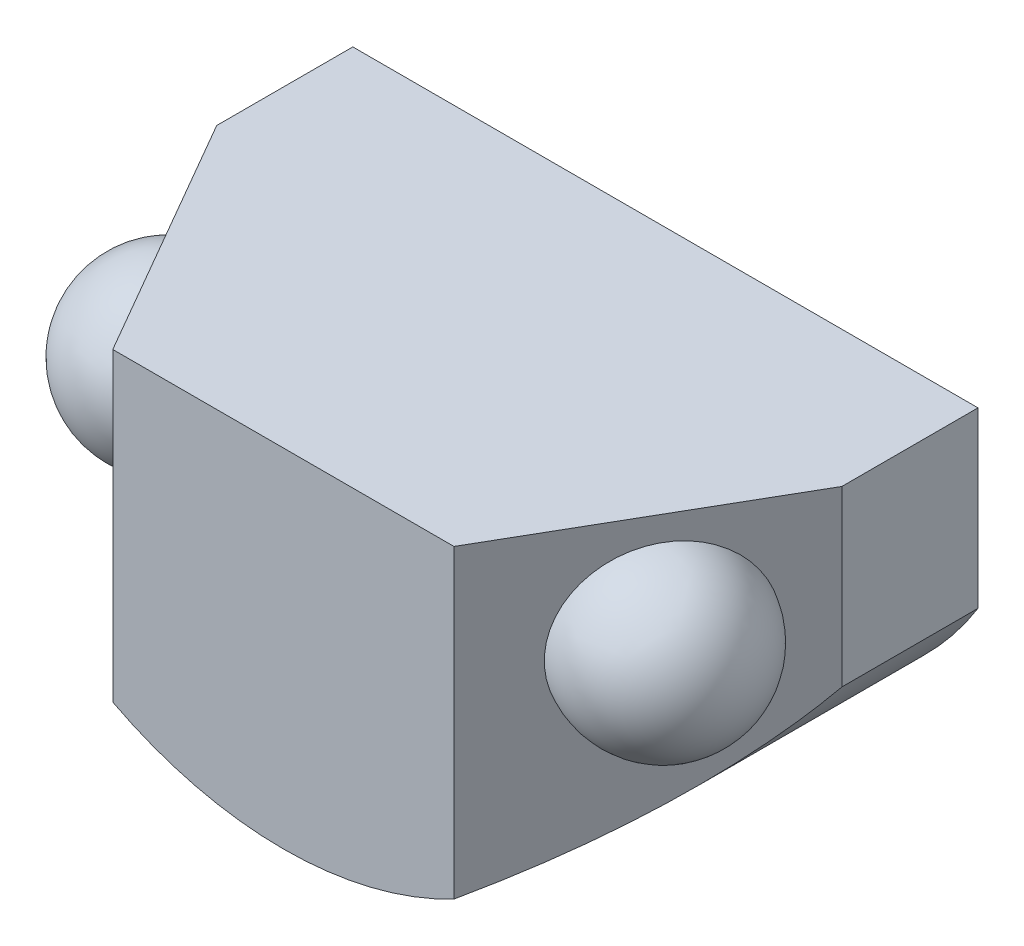
ISO-10303-21;
HEADER;
FILE_DESCRIPTION(('STEP AP214'),'2;1');
FILE_NAME('part.step','',(''),(''),'','','');
FILE_SCHEMA(('AUTOMOTIVE_DESIGN { 1 0 10303 214 1 1 1 1 }'));
ENDSEC;
DATA;
#1=APPLICATION_CONTEXT('core data for automotive mechanical design processes');
#2=APPLICATION_PROTOCOL_DEFINITION('international standard','automotive_design',2000,#1);
#3=PRODUCT_CONTEXT('',#1,'mechanical');
#4=PRODUCT('Part','Part','',(#3));
#5=PRODUCT_RELATED_PRODUCT_CATEGORY('part','',(#4));
#6=PRODUCT_DEFINITION_FORMATION('','',#4);
#7=PRODUCT_DEFINITION_CONTEXT('part definition',#1,'design');
#8=PRODUCT_DEFINITION('design','',#6,#7);
#9=PRODUCT_DEFINITION_SHAPE('','',#8);
#10=(LENGTH_UNIT() NAMED_UNIT(*) SI_UNIT(.MILLI.,.METRE.));
#11=(NAMED_UNIT(*) PLANE_ANGLE_UNIT() SI_UNIT($,.RADIAN.));
#12=(NAMED_UNIT(*) SI_UNIT($,.STERADIAN.) SOLID_ANGLE_UNIT());
#13=UNCERTAINTY_MEASURE_WITH_UNIT(LENGTH_MEASURE(1.E-05),#10,'distance_accuracy_value','');
#14=(GEOMETRIC_REPRESENTATION_CONTEXT(3) GLOBAL_UNCERTAINTY_ASSIGNED_CONTEXT((#13)) GLOBAL_UNIT_ASSIGNED_CONTEXT((#10,
#11,#12)) REPRESENTATION_CONTEXT('',''));
#15=CARTESIAN_POINT('',(0.,0.,0.));
#16=DIRECTION('',(0.,0.,1.));
#17=DIRECTION('',(1.,0.,0.));
#18=AXIS2_PLACEMENT_3D('',#15,#16,#17);
#19=CARTESIAN_POINT('',(90.,50.,55.));
#20=DIRECTION('',(-1.,0.,0.));
#21=DIRECTION('',(0.,0.,1.));
#22=AXIS2_PLACEMENT_3D('',#19,#20,#21);
#23=PLANE('',#22);
#24=DIRECTION('',(0.,1.,0.));
#25=VECTOR('',#24,1.);
#26=CARTESIAN_POINT('',(90.,-50.,-15.808309090852));
#27=LINE('',#26,#25);
#28=CARTESIAN_POINT('',(90.,0.,-15.808309090852));
#29=VERTEX_POINT('',#28);
#30=CARTESIAN_POINT('',(90.,50.,-15.808309090852));
#31=VERTEX_POINT('',#30);
#32=EDGE_CURVE('E86',#29,#31,#27,.T.);
#33=ORIENTED_EDGE('',*,*,#32,.F.);
#34=DIRECTION('',(0.,0.,-1.));
#35=VECTOR('',#34,1.);
#36=CARTESIAN_POINT('',(90.,0.,55.));
#37=LINE('',#36,#35);
#38=CARTESIAN_POINT('',(90.,0.,-55.));
#39=VERTEX_POINT('',#38);
#40=EDGE_CURVE('E113',#29,#39,#37,.T.);
#41=ORIENTED_EDGE('',*,*,#40,.T.);
#42=DIRECTION('',(0.,-1.,0.));
#43=VECTOR('',#42,1.);
#44=CARTESIAN_POINT('',(90.,50.,-55.));
#45=LINE('',#44,#43);
#46=CARTESIAN_POINT('',(90.,50.,-55.));
#47=VERTEX_POINT('',#46);
#48=EDGE_CURVE('E106',#47,#39,#45,.T.);
#49=ORIENTED_EDGE('',*,*,#48,.F.);
#50=DIRECTION('',(0.,0.,-1.));
#51=VECTOR('',#50,1.);
#52=CARTESIAN_POINT('',(90.,50.,55.));
#53=LINE('',#52,#51);
#54=EDGE_CURVE('E97',#31,#47,#53,.T.);
#55=ORIENTED_EDGE('',*,*,#54,.F.);
#56=EDGE_LOOP('',(#33,#41,#49,#55));
#57=FACE_BOUND('',#56,.T.);
#58=ADVANCED_FACE('F35',(#57),#23,.F.);
#59=CARTESIAN_POINT('',(-90.,50.,55.));
#60=DIRECTION('',(0.,0.,-1.));
#61=DIRECTION('',(-1.,0.,0.));
#62=AXIS2_PLACEMENT_3D('',#59,#60,#61);
#63=PLANE('',#62);
#64=DIRECTION('',(0.,1.,0.));
#65=VECTOR('',#64,1.);
#66=CARTESIAN_POINT('',(49.1188036855349,-50.,55.));
#67=LINE('',#66,#65);
#68=CARTESIAN_POINT('',(49.1188036855349,-37.9326520678613,55.));
#69=VERTEX_POINT('',#68);
#70=CARTESIAN_POINT('',(49.1188036855349,50.,55.));
#71=VERTEX_POINT('',#70);
#72=EDGE_CURVE('E49',#69,#71,#67,.T.);
#73=ORIENTED_EDGE('',*,*,#72,.T.);
#74=DIRECTION('',(1.,0.,0.));
#75=VECTOR('',#74,1.);
#76=CARTESIAN_POINT('',(-90.,50.,55.));
#77=LINE('',#76,#75);
#78=CARTESIAN_POINT('',(-49.1188036855349,50.,55.));
#79=VERTEX_POINT('',#78);
#80=EDGE_CURVE('E101',#79,#71,#77,.T.);
#81=ORIENTED_EDGE('',*,*,#80,.F.);
#82=DIRECTION('',(0.,1.,0.));
#83=VECTOR('',#82,1.);
#84=CARTESIAN_POINT('',(-49.1188036855349,-50.,55.));
#85=LINE('',#84,#83);
#86=CARTESIAN_POINT('',(-49.1188036855349,-37.9326520678613,55.));
#87=VERTEX_POINT('',#86);
#88=EDGE_CURVE('E145',#87,#79,#85,.T.);
#89=ORIENTED_EDGE('',*,*,#88,.F.);
#90=CARTESIAN_POINT('',(0.,56.,55.));
#91=DIRECTION('',(0.,0.,-1.));
#92=DIRECTION('',(-1.,0.,0.));
#93=AXIS2_PLACEMENT_3D('',#90,#91,#92);
#94=CIRCLE('',#93,106.);
#95=EDGE_CURVE('E123',#69,#87,#94,.T.);
#96=ORIENTED_EDGE('',*,*,#95,.F.);
#97=EDGE_LOOP('',(#73,#81,#89,#96));
#98=FACE_BOUND('',#97,.T.);
#99=ADVANCED_FACE('F169',(#98),#63,.F.);
#100=CARTESIAN_POINT('',(0.,50.,0.));
#101=DIRECTION('',(0.,-1.,0.));
#102=DIRECTION('',(0.,0.,-1.));
#103=AXIS2_PLACEMENT_3D('',#100,#101,#102);
#104=PLANE('',#103);
#105=DIRECTION('',(0.499999999999995,0.,-0.866025403784442));
#106=VECTOR('',#105,1.);
#107=CARTESIAN_POINT('',(49.1188036855349,50.,55.));
#108=LINE('',#107,#106);
#109=EDGE_CURVE('E89',#71,#31,#108,.T.);
#110=ORIENTED_EDGE('',*,*,#109,.T.);
#111=ORIENTED_EDGE('',*,*,#54,.T.);
#112=DIRECTION('',(-1.,0.,0.));
#113=VECTOR('',#112,1.);
#114=CARTESIAN_POINT('',(-90.,50.,-55.));
#115=LINE('',#114,#113);
#116=CARTESIAN_POINT('',(-90.,50.,-55.));
#117=VERTEX_POINT('',#116);
#118=EDGE_CURVE('E107',#47,#117,#115,.T.);
#119=ORIENTED_EDGE('',*,*,#118,.T.);
#120=DIRECTION('',(0.,0.,1.));
#121=VECTOR('',#120,1.);
#122=CARTESIAN_POINT('',(-90.,50.,55.));
#123=LINE('',#122,#121);
#124=CARTESIAN_POINT('',(-90.,50.,-15.808309090852));
#125=VERTEX_POINT('',#124);
#126=EDGE_CURVE('E110',#117,#125,#123,.T.);
#127=ORIENTED_EDGE('',*,*,#126,.T.);
#128=DIRECTION('',(-0.499999999999995,0.,-0.866025403784442));
#129=VECTOR('',#128,1.);
#130=CARTESIAN_POINT('',(-49.1188036855349,50.,55.));
#131=LINE('',#130,#129);
#132=EDGE_CURVE('E142',#79,#125,#131,.T.);
#133=ORIENTED_EDGE('',*,*,#132,.F.);
#134=ORIENTED_EDGE('',*,*,#80,.T.);
#135=EDGE_LOOP('',(#110,#111,#119,#127,#133,#134));
#136=FACE_BOUND('',#135,.T.);
#137=ADVANCED_FACE('F96',(#136),#104,.F.);
#138=CARTESIAN_POINT('',(0.,56.,241.815416922694));
#139=DIRECTION('',(0.,0.,-1.));
#140=DIRECTION('',(-1.,0.,0.));
#141=AXIS2_PLACEMENT_3D('',#138,#139,#140);
#142=CYLINDRICAL_SURFACE('',#141,106.);
#143=CARTESIAN_POINT('',(0.,56.,140.076263590349));
#144=DIRECTION('',(0.866025403784442,0.,0.499999999999995));
#145=DIRECTION('',(0.499999999999995,0.,-0.866025403784442));
#146=AXIS2_PLACEMENT_3D('',#143,#144,#145);
#147=ELLIPSE('',#146,212.000000000002,106.);
#148=EDGE_CURVE('E42',#69,#29,#147,.T.);
#149=ORIENTED_EDGE('',*,*,#148,.F.);
#150=ORIENTED_EDGE('',*,*,#95,.T.);
#151=CARTESIAN_POINT('',(0.,56.,140.076263590349));
#152=DIRECTION('',(0.866025403784442,0.,-0.499999999999995));
#153=DIRECTION('',(-0.499999999999995,0.,-0.866025403784442));
#154=AXIS2_PLACEMENT_3D('',#151,#152,#153);
#155=ELLIPSE('',#154,212.000000000002,106.);
#156=CARTESIAN_POINT('',(-90.,0.,-15.808309090852));
#157=VERTEX_POINT('',#156);
#158=EDGE_CURVE('E128',#87,#157,#155,.T.);
#159=ORIENTED_EDGE('',*,*,#158,.T.);
#160=DIRECTION('',(0.,0.,1.));
#161=VECTOR('',#160,1.);
#162=CARTESIAN_POINT('',(-90.,0.,55.));
#163=LINE('',#162,#161);
#164=CARTESIAN_POINT('',(-90.,0.,-55.));
#165=VERTEX_POINT('',#164);
#166=EDGE_CURVE('E108',#165,#157,#163,.T.);
#167=ORIENTED_EDGE('',*,*,#166,.F.);
#168=CARTESIAN_POINT('',(0.,56.,-55.));
#169=DIRECTION('',(0.,0.,1.));
#170=DIRECTION('',(1.,0.,0.));
#171=AXIS2_PLACEMENT_3D('',#168,#169,#170);
#172=CIRCLE('',#171,106.);
#173=EDGE_CURVE('E116',#165,#39,#172,.T.);
#174=ORIENTED_EDGE('',*,*,#173,.T.);
#175=ORIENTED_EDGE('',*,*,#40,.F.);
#176=EDGE_LOOP('',(#149,#150,#159,#167,#174,#175));
#177=FACE_BOUND('',#176,.T.);
#178=ADVANCED_FACE('F151',(#177),#142,.T.);
#179=CARTESIAN_POINT('',(-90.,50.,-55.));
#180=DIRECTION('',(0.,0.,1.));
#181=DIRECTION('',(1.,0.,0.));
#182=AXIS2_PLACEMENT_3D('',#179,#180,#181);
#183=PLANE('',#182);
#184=CARTESIAN_POINT('',(0.,0.,-55.));
#185=DIRECTION('',(0.,0.,1.));
#186=DIRECTION('',(1.,0.,0.));
#187=AXIS2_PLACEMENT_3D('',#184,#185,#186);
#188=CIRCLE('',#187,5.);
#189=CARTESIAN_POINT('',(5.,0.,-55.));
#190=VERTEX_POINT('',#189);
#191=EDGE_CURVE('E102',#190,#190,#188,.T.);
#192=ORIENTED_EDGE('',*,*,#191,.T.);
#193=EDGE_LOOP('',(#192));
#194=FACE_BOUND('',#193,.T.);
#195=ORIENTED_EDGE('',*,*,#48,.T.);
#196=ORIENTED_EDGE('',*,*,#173,.F.);
#197=DIRECTION('',(0.,-1.,0.));
#198=VECTOR('',#197,1.);
#199=CARTESIAN_POINT('',(-90.,50.,-55.));
#200=LINE('',#199,#198);
#201=EDGE_CURVE('E122',#117,#165,#200,.T.);
#202=ORIENTED_EDGE('',*,*,#201,.F.);
#203=ORIENTED_EDGE('',*,*,#118,.F.);
#204=EDGE_LOOP('',(#195,#196,#202,#203));
#205=FACE_BOUND('',#204,.T.);
#206=ADVANCED_FACE('F154',(#194,#205),#183,.F.);
#207=CARTESIAN_POINT('',(-90.,50.,55.));
#208=DIRECTION('',(1.,0.,0.));
#209=DIRECTION('',(0.,0.,-1.));
#210=AXIS2_PLACEMENT_3D('',#207,#208,#209);
#211=PLANE('',#210);
#212=ORIENTED_EDGE('',*,*,#166,.T.);
#213=DIRECTION('',(0.,1.,0.));
#214=VECTOR('',#213,1.);
#215=CARTESIAN_POINT('',(-90.,-50.,-15.808309090852));
#216=LINE('',#215,#214);
#217=EDGE_CURVE('E57',#157,#125,#216,.T.);
#218=ORIENTED_EDGE('',*,*,#217,.T.);
#219=ORIENTED_EDGE('',*,*,#126,.F.);
#220=ORIENTED_EDGE('',*,*,#201,.T.);
#221=EDGE_LOOP('',(#212,#218,#219,#220));
#222=FACE_BOUND('',#221,.T.);
#223=ADVANCED_FACE('F157',(#222),#211,.F.);
#224=CARTESIAN_POINT('',(-49.1188036855349,-50.,55.));
#225=DIRECTION('',(0.866025403784442,0.,-0.499999999999995));
#226=DIRECTION('',(-0.499999999999995,0.,-0.866025403784442));
#227=AXIS2_PLACEMENT_3D('',#224,#225,#226);
#228=PLANE('',#227);
#229=CARTESIAN_POINT('',(-71.1373818974067,17.9425764885766,16.8627038266085));
#230=DIRECTION('',(0.866025403784442,0.,-0.499999999999995));
#231=DIRECTION('',(-0.499999999999995,0.,-0.866025403784442));
#232=AXIS2_PLACEMENT_3D('',#229,#230,#231);
#233=CIRCLE('',#232,25.);
#234=CARTESIAN_POINT('',(-83.6373818974066,17.9425764885766,-4.78793126800255));
#235=VERTEX_POINT('',#234);
#236=EDGE_CURVE('E133',#235,#235,#233,.T.);
#237=ORIENTED_EDGE('',*,*,#236,.T.);
#238=EDGE_LOOP('',(#237));
#239=FACE_BOUND('',#238,.T.);
#240=ORIENTED_EDGE('',*,*,#88,.T.);
#241=ORIENTED_EDGE('',*,*,#132,.T.);
#242=ORIENTED_EDGE('',*,*,#217,.F.);
#243=ORIENTED_EDGE('',*,*,#158,.F.);
#244=EDGE_LOOP('',(#240,#241,#242,#243));
#245=FACE_BOUND('',#244,.T.);
#246=ADVANCED_FACE('F159',(#239,#245),#228,.F.);
#247=CARTESIAN_POINT('',(49.1188036855349,-50.,55.));
#248=DIRECTION('',(0.866025403784442,0.,0.499999999999995));
#249=DIRECTION('',(0.499999999999995,0.,-0.866025403784442));
#250=AXIS2_PLACEMENT_3D('',#247,#248,#249);
#251=PLANE('',#250);
#252=CARTESIAN_POINT('',(71.1373818974067,17.9425764885766,16.8627038266085));
#253=DIRECTION('',(0.866025403784442,0.,0.499999999999995));
#254=DIRECTION('',(0.499999999999995,0.,-0.866025403784442));
#255=AXIS2_PLACEMENT_3D('',#252,#253,#254);
#256=CIRCLE('',#255,25.);
#257=CARTESIAN_POINT('',(83.6373818974066,17.9425764885766,-4.78793126800255));
#258=VERTEX_POINT('',#257);
#259=EDGE_CURVE('E11',#258,#258,#256,.T.);
#260=ORIENTED_EDGE('',*,*,#259,.F.);
#261=EDGE_LOOP('',(#260));
#262=FACE_BOUND('',#261,.T.);
#263=ORIENTED_EDGE('',*,*,#148,.T.);
#264=ORIENTED_EDGE('',*,*,#32,.T.);
#265=ORIENTED_EDGE('',*,*,#109,.F.);
#266=ORIENTED_EDGE('',*,*,#72,.F.);
#267=EDGE_LOOP('',(#263,#264,#265,#266));
#268=FACE_BOUND('',#267,.T.);
#269=ADVANCED_FACE('F88',(#262,#268),#251,.T.);
#270=CARTESIAN_POINT('',(0.,0.,-45.));
#271=DIRECTION('',(0.,0.,-1.));
#272=DIRECTION('',(-1.,0.,0.));
#273=AXIS2_PLACEMENT_3D('',#270,#271,#272);
#274=CYLINDRICAL_SURFACE('',#273,5.);
#275=CARTESIAN_POINT('',(0.,0.,-65.));
#276=DIRECTION('',(0.,0.,-1.));
#277=DIRECTION('',(-1.,0.,0.));
#278=AXIS2_PLACEMENT_3D('',#275,#276,#277);
#279=CIRCLE('',#278,5.);
#280=CARTESIAN_POINT('',(-5.,0.,-65.));
#281=VERTEX_POINT('',#280);
#282=EDGE_CURVE('E132',#281,#281,#279,.T.);
#283=ORIENTED_EDGE('',*,*,#282,.F.);
#284=EDGE_LOOP('',(#283));
#285=FACE_BOUND('',#284,.T.);
#286=ORIENTED_EDGE('',*,*,#191,.F.);
#287=EDGE_LOOP('',(#286));
#288=FACE_BOUND('',#287,.T.);
#289=ADVANCED_FACE('F183',(#285,#288),#274,.T.);
#290=CARTESIAN_POINT('',(0.,0.,-65.));
#291=DIRECTION('',(0.,0.,-1.));
#292=DIRECTION('',(-1.,0.,0.));
#293=AXIS2_PLACEMENT_3D('',#290,#291,#292);
#294=PLANE('',#293);
#295=ORIENTED_EDGE('',*,*,#282,.T.);
#296=EDGE_LOOP('',(#295));
#297=FACE_BOUND('',#296,.T.);
#298=ADVANCED_FACE('F187',(#297),#294,.T.);
#299=CARTESIAN_POINT('',(-71.1373818974067,17.9425764885766,16.8627038266085));
#300=DIRECTION('',(0.,1.,0.));
#301=DIRECTION('',(-0.499999999999995,0.,-0.866025403784442));
#302=AXIS2_PLACEMENT_3D('',#299,#300,#301);
#303=SPHERICAL_SURFACE('',#302,25.);
#304=CARTESIAN_POINT('',(-71.1373818974067,17.9425764885766,16.8627038266085));
#305=DIRECTION('',(0.866025403784442,0.,-0.499999999999995));
#306=DIRECTION('',(-0.499999999999995,0.,-0.866025403784442));
#307=AXIS2_PLACEMENT_3D('',#304,#305,#306);
#308=SPHERICAL_SURFACE('',#307,25.);
#309=ORIENTED_EDGE('',*,*,#236,.F.);
#310=EDGE_LOOP('',(#309));
#311=FACE_BOUND('',#310,.T.);
#312=ADVANCED_FACE('F191',(#311),#308,.T.);
#313=CARTESIAN_POINT('',(71.1373818974067,17.9425764885766,16.8627038266085));
#314=DIRECTION('',(0.,1.,0.));
#315=DIRECTION('',(0.499999999999995,0.,-0.866025403784442));
#316=AXIS2_PLACEMENT_3D('',#313,#314,#315);
#317=SPHERICAL_SURFACE('',#316,25.);
#318=CARTESIAN_POINT('',(71.1373818974067,17.9425764885766,16.8627038266085));
#319=DIRECTION('',(0.866025403784442,0.,0.499999999999995));
#320=DIRECTION('',(0.499999999999995,0.,-0.866025403784442));
#321=AXIS2_PLACEMENT_3D('',#318,#319,#320);
#322=SPHERICAL_SURFACE('',#321,25.);
#323=ORIENTED_EDGE('',*,*,#259,.T.);
#324=EDGE_LOOP('',(#323));
#325=FACE_BOUND('',#324,.T.);
#326=ADVANCED_FACE('F194',(#325),#322,.T.);
#327=CLOSED_SHELL('',(#58,#99,#137,#178,#206,#223,#246,#269,#289,#298,#312,#326));
#328=MANIFOLD_SOLID_BREP('B2',#327);
#329=ADVANCED_BREP_SHAPE_REPRESENTATION('',(#18,#328),#14);
#330=SHAPE_DEFINITION_REPRESENTATION(#9,#329);
ENDSEC;
END-ISO-10303-21;
